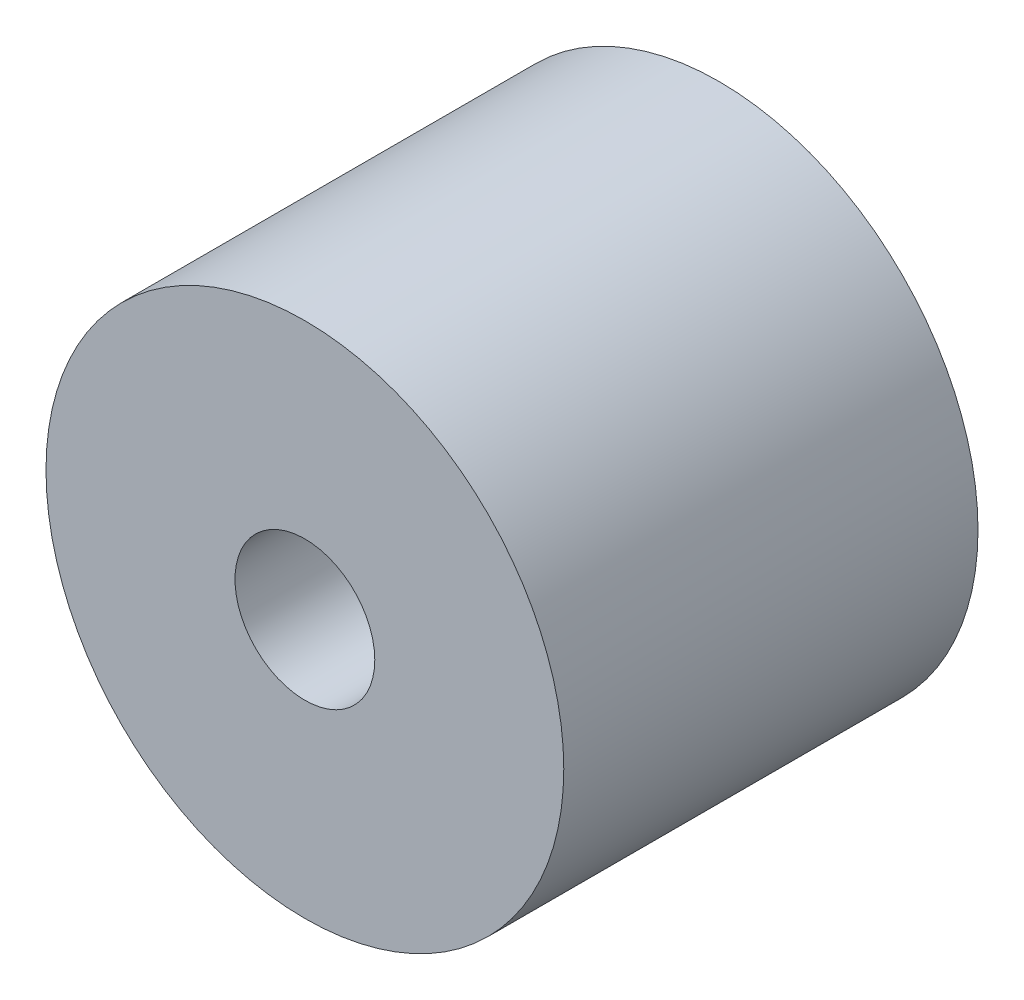
ISO-10303-21;
HEADER;
FILE_DESCRIPTION(('STEP AP214'),'2;1');
FILE_NAME('part.step','',(''),(''),'','','');
FILE_SCHEMA(('AUTOMOTIVE_DESIGN { 1 0 10303 214 1 1 1 1 }'));
ENDSEC;
DATA;
#1=APPLICATION_CONTEXT('core data for automotive mechanical design processes');
#2=APPLICATION_PROTOCOL_DEFINITION('international standard','automotive_design',2000,#1);
#3=PRODUCT_CONTEXT('',#1,'mechanical');
#4=PRODUCT('Part','Part','',(#3));
#5=PRODUCT_RELATED_PRODUCT_CATEGORY('part','',(#4));
#6=PRODUCT_DEFINITION_FORMATION('','',#4);
#7=PRODUCT_DEFINITION_CONTEXT('part definition',#1,'design');
#8=PRODUCT_DEFINITION('design','',#6,#7);
#9=PRODUCT_DEFINITION_SHAPE('','',#8);
#10=(LENGTH_UNIT() NAMED_UNIT(*) SI_UNIT(.MILLI.,.METRE.));
#11=(NAMED_UNIT(*) PLANE_ANGLE_UNIT() SI_UNIT($,.RADIAN.));
#12=(NAMED_UNIT(*) SI_UNIT($,.STERADIAN.) SOLID_ANGLE_UNIT());
#13=UNCERTAINTY_MEASURE_WITH_UNIT(LENGTH_MEASURE(1.E-05),#10,'distance_accuracy_value','');
#14=(GEOMETRIC_REPRESENTATION_CONTEXT(3) GLOBAL_UNCERTAINTY_ASSIGNED_CONTEXT((#13)) GLOBAL_UNIT_ASSIGNED_CONTEXT((#10,
#11,#12)) REPRESENTATION_CONTEXT('',''));
#15=CARTESIAN_POINT('',(0.,0.,0.));
#16=DIRECTION('',(0.,0.,1.));
#17=DIRECTION('',(1.,0.,0.));
#18=AXIS2_PLACEMENT_3D('',#15,#16,#17);
#19=CARTESIAN_POINT('',(0.,0.,-10.16));
#20=DIRECTION('',(0.,0.,1.));
#21=DIRECTION('',(1.,0.,0.));
#22=AXIS2_PLACEMENT_3D('',#19,#20,#21);
#23=CYLINDRICAL_SURFACE('',#22,6.35);
#24=CARTESIAN_POINT('',(0.,0.,-10.16));
#25=DIRECTION('',(0.,0.,1.));
#26=DIRECTION('',(1.,0.,0.));
#27=AXIS2_PLACEMENT_3D('',#24,#25,#26);
#28=CIRCLE('',#27,6.35);
#29=CARTESIAN_POINT('',(6.35,0.,-10.16));
#30=VERTEX_POINT('',#29);
#31=EDGE_CURVE('E10',#30,#30,#28,.T.);
#32=ORIENTED_EDGE('',*,*,#31,.T.);
#33=EDGE_LOOP('',(#32));
#34=FACE_BOUND('',#33,.T.);
#35=CARTESIAN_POINT('',(0.,0.,0.));
#36=DIRECTION('',(0.,0.,1.));
#37=DIRECTION('',(1.,0.,0.));
#38=AXIS2_PLACEMENT_3D('',#35,#36,#37);
#39=CIRCLE('',#38,6.35);
#40=CARTESIAN_POINT('',(6.35,0.,0.));
#41=VERTEX_POINT('',#40);
#42=EDGE_CURVE('E36',#41,#41,#39,.T.);
#43=ORIENTED_EDGE('',*,*,#42,.F.);
#44=EDGE_LOOP('',(#43));
#45=FACE_BOUND('',#44,.T.);
#46=ADVANCED_FACE('F33',(#34,#45),#23,.T.);
#47=CARTESIAN_POINT('',(0.,0.,-10.16));
#48=DIRECTION('',(0.,0.,1.));
#49=DIRECTION('',(1.,0.,0.));
#50=AXIS2_PLACEMENT_3D('',#47,#48,#49);
#51=PLANE('',#50);
#52=CARTESIAN_POINT('',(0.,0.,-10.16));
#53=DIRECTION('',(0.,0.,1.));
#54=DIRECTION('',(1.,0.,0.));
#55=AXIS2_PLACEMENT_3D('',#52,#53,#54);
#56=CIRCLE('',#55,1.7145);
#57=CARTESIAN_POINT('',(1.7145,0.,-10.16));
#58=VERTEX_POINT('',#57);
#59=EDGE_CURVE('E43',#58,#58,#56,.T.);
#60=ORIENTED_EDGE('',*,*,#59,.T.);
#61=EDGE_LOOP('',(#60));
#62=FACE_BOUND('',#61,.T.);
#63=ORIENTED_EDGE('',*,*,#31,.F.);
#64=EDGE_LOOP('',(#63));
#65=FACE_BOUND('',#64,.T.);
#66=ADVANCED_FACE('F56',(#62,#65),#51,.F.);
#67=CARTESIAN_POINT('',(0.,0.,0.));
#68=DIRECTION('',(0.,0.,1.));
#69=DIRECTION('',(1.,0.,0.));
#70=AXIS2_PLACEMENT_3D('',#67,#68,#69);
#71=PLANE('',#70);
#72=CARTESIAN_POINT('',(0.,0.,0.));
#73=DIRECTION('',(0.,0.,1.));
#74=DIRECTION('',(1.,0.,0.));
#75=AXIS2_PLACEMENT_3D('',#72,#73,#74);
#76=CIRCLE('',#75,1.7145);
#77=CARTESIAN_POINT('',(1.7145,0.,0.));
#78=VERTEX_POINT('',#77);
#79=EDGE_CURVE('E47',#78,#78,#76,.T.);
#80=ORIENTED_EDGE('',*,*,#79,.F.);
#81=EDGE_LOOP('',(#80));
#82=FACE_BOUND('',#81,.T.);
#83=ORIENTED_EDGE('',*,*,#42,.T.);
#84=EDGE_LOOP('',(#83));
#85=FACE_BOUND('',#84,.T.);
#86=ADVANCED_FACE('F53',(#82,#85),#71,.T.);
#87=CARTESIAN_POINT('',(0.,0.,0.));
#88=DIRECTION('',(0.,0.,1.));
#89=DIRECTION('',(1.,0.,0.));
#90=AXIS2_PLACEMENT_3D('',#87,#88,#89);
#91=CYLINDRICAL_SURFACE('',#90,1.7145);
#92=ORIENTED_EDGE('',*,*,#59,.F.);
#93=EDGE_LOOP('',(#92));
#94=FACE_BOUND('',#93,.T.);
#95=ORIENTED_EDGE('',*,*,#79,.T.);
#96=EDGE_LOOP('',(#95));
#97=FACE_BOUND('',#96,.T.);
#98=ADVANCED_FACE('F51',(#94,#97),#91,.F.);
#99=CLOSED_SHELL('',(#46,#66,#86,#98));
#100=MANIFOLD_SOLID_BREP('B2',#99);
#101=ADVANCED_BREP_SHAPE_REPRESENTATION('',(#18,#100),#14);
#102=SHAPE_DEFINITION_REPRESENTATION(#9,#101);
ENDSEC;
END-ISO-10303-21;
